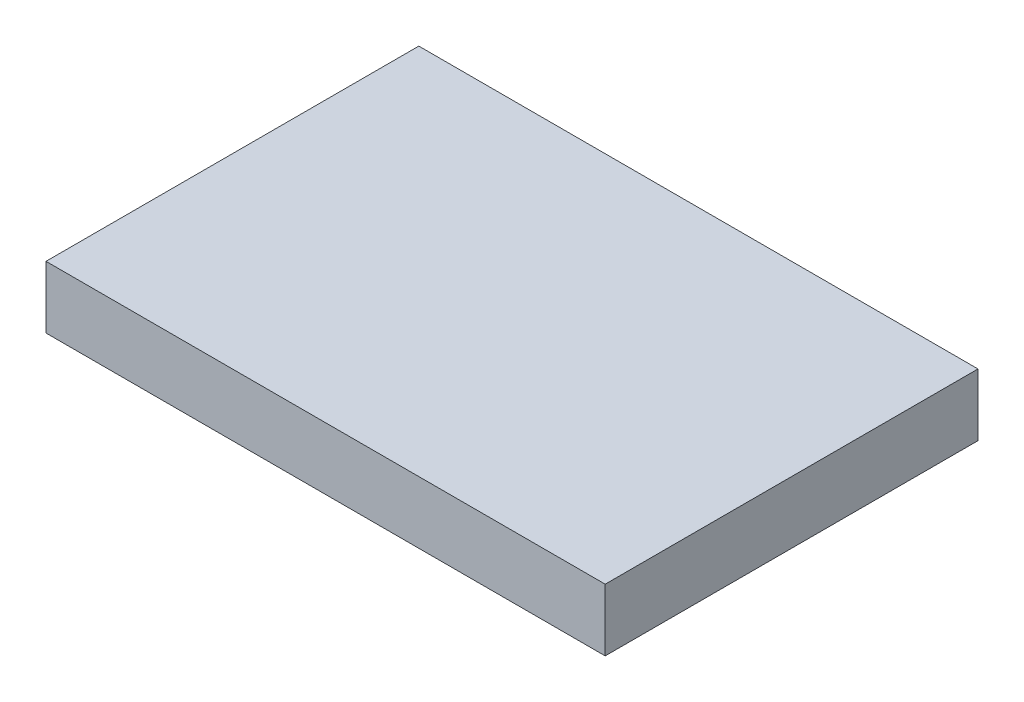
ISO-10303-21;
HEADER;
FILE_DESCRIPTION(('STEP AP214'),'2;1');
FILE_NAME('part.step','',(''),(''),'','','');
FILE_SCHEMA(('AUTOMOTIVE_DESIGN { 1 0 10303 214 1 1 1 1 }'));
ENDSEC;
DATA;
#1=APPLICATION_CONTEXT('core data for automotive mechanical design processes');
#2=APPLICATION_PROTOCOL_DEFINITION('international standard','automotive_design',2000,#1);
#3=PRODUCT_CONTEXT('',#1,'mechanical');
#4=PRODUCT('Part','Part','',(#3));
#5=PRODUCT_RELATED_PRODUCT_CATEGORY('part','',(#4));
#6=PRODUCT_DEFINITION_FORMATION('','',#4);
#7=PRODUCT_DEFINITION_CONTEXT('part definition',#1,'design');
#8=PRODUCT_DEFINITION('design','',#6,#7);
#9=PRODUCT_DEFINITION_SHAPE('','',#8);
#10=(LENGTH_UNIT() NAMED_UNIT(*) SI_UNIT(.MILLI.,.METRE.));
#11=(NAMED_UNIT(*) PLANE_ANGLE_UNIT() SI_UNIT($,.RADIAN.));
#12=(NAMED_UNIT(*) SI_UNIT($,.STERADIAN.) SOLID_ANGLE_UNIT());
#13=UNCERTAINTY_MEASURE_WITH_UNIT(LENGTH_MEASURE(1.E-05),#10,'distance_accuracy_value','');
#14=(GEOMETRIC_REPRESENTATION_CONTEXT(3) GLOBAL_UNCERTAINTY_ASSIGNED_CONTEXT((#13)) GLOBAL_UNIT_ASSIGNED_CONTEXT((#10,
#11,#12)) REPRESENTATION_CONTEXT('',''));
#15=CARTESIAN_POINT('',(0.,0.,0.));
#16=DIRECTION('',(0.,0.,1.));
#17=DIRECTION('',(1.,0.,0.));
#18=AXIS2_PLACEMENT_3D('',#15,#16,#17);
#19=CARTESIAN_POINT('',(0.,0.,0.));
#20=DIRECTION('',(0.,-1.,0.));
#21=DIRECTION('',(1.,0.,0.));
#22=AXIS2_PLACEMENT_3D('',#19,#20,#21);
#23=PLANE('',#22);
#24=DIRECTION('',(0.,0.,-1.));
#25=VECTOR('',#24,1.);
#26=CARTESIAN_POINT('',(-8.99999999999999,0.,6.00000000000001));
#27=LINE('',#26,#25);
#28=CARTESIAN_POINT('',(-8.99999999999999,0.,6.00000000000001));
#29=VERTEX_POINT('',#28);
#30=CARTESIAN_POINT('',(-8.99999999999999,0.,-6.00000000000004));
#31=VERTEX_POINT('',#30);
#32=EDGE_CURVE('E55',#29,#31,#27,.T.);
#33=ORIENTED_EDGE('',*,*,#32,.T.);
#34=DIRECTION('',(1.,0.,0.));
#35=VECTOR('',#34,1.);
#36=CARTESIAN_POINT('',(-8.99999999999999,0.,-6.00000000000004));
#37=LINE('',#36,#35);
#38=CARTESIAN_POINT('',(8.99999999999999,0.,-6.00000000000004));
#39=VERTEX_POINT('',#38);
#40=EDGE_CURVE('E76',#31,#39,#37,.T.);
#41=ORIENTED_EDGE('',*,*,#40,.T.);
#42=DIRECTION('',(0.,0.,1.));
#43=VECTOR('',#42,1.);
#44=CARTESIAN_POINT('',(8.99999999999999,0.,6.00000000000001));
#45=LINE('',#44,#43);
#46=CARTESIAN_POINT('',(8.99999999999999,0.,6.00000000000001));
#47=VERTEX_POINT('',#46);
#48=EDGE_CURVE('E58',#39,#47,#45,.T.);
#49=ORIENTED_EDGE('',*,*,#48,.T.);
#50=DIRECTION('',(-1.,0.,0.));
#51=VECTOR('',#50,1.);
#52=CARTESIAN_POINT('',(-8.99999999999999,0.,6.00000000000001));
#53=LINE('',#52,#51);
#54=EDGE_CURVE('E20',#47,#29,#53,.T.);
#55=ORIENTED_EDGE('',*,*,#54,.T.);
#56=EDGE_LOOP('',(#33,#41,#49,#55));
#57=FACE_BOUND('',#56,.T.);
#58=ADVANCED_FACE('F17',(#57),#23,.T.);
#59=CARTESIAN_POINT('',(-8.99999999999999,2.,6.00000000000001));
#60=DIRECTION('',(0.,0.,-1.));
#61=DIRECTION('',(-1.,0.,0.));
#62=AXIS2_PLACEMENT_3D('',#59,#60,#61);
#63=PLANE('',#62);
#64=DIRECTION('',(0.,1.,0.));
#65=VECTOR('',#64,1.);
#66=CARTESIAN_POINT('',(8.99999999999999,1.99999999999999,6.00000000000001));
#67=LINE('',#66,#65);
#68=CARTESIAN_POINT('',(8.99999999999999,2.,6.00000000000001));
#69=VERTEX_POINT('',#68);
#70=EDGE_CURVE('E78',#47,#69,#67,.T.);
#71=ORIENTED_EDGE('',*,*,#70,.T.);
#72=DIRECTION('',(1.,0.,0.));
#73=VECTOR('',#72,1.);
#74=CARTESIAN_POINT('',(0.,2.,6.00000000000001));
#75=LINE('',#74,#73);
#76=CARTESIAN_POINT('',(-8.99999999999999,2.,6.00000000000001));
#77=VERTEX_POINT('',#76);
#78=EDGE_CURVE('E73',#69,#77,#75,.F.);
#79=ORIENTED_EDGE('',*,*,#78,.T.);
#80=DIRECTION('',(0.,1.,0.));
#81=VECTOR('',#80,1.);
#82=CARTESIAN_POINT('',(-8.99999999999999,2.,6.00000000000001));
#83=LINE('',#82,#81);
#84=EDGE_CURVE('E63',#77,#29,#83,.F.);
#85=ORIENTED_EDGE('',*,*,#84,.T.);
#86=ORIENTED_EDGE('',*,*,#54,.F.);
#87=EDGE_LOOP('',(#71,#79,#85,#86));
#88=FACE_BOUND('',#87,.T.);
#89=ADVANCED_FACE('F72',(#88),#63,.F.);
#90=CARTESIAN_POINT('',(-8.99999999999999,2.,6.00000000000001));
#91=DIRECTION('',(1.,0.,0.));
#92=DIRECTION('',(0.,0.,-1.));
#93=AXIS2_PLACEMENT_3D('',#90,#91,#92);
#94=PLANE('',#93);
#95=ORIENTED_EDGE('',*,*,#84,.F.);
#96=DIRECTION('',(0.,0.,1.));
#97=VECTOR('',#96,1.);
#98=CARTESIAN_POINT('',(-8.99999999999999,2.,0.));
#99=LINE('',#98,#97);
#100=CARTESIAN_POINT('',(-8.99999999999999,2.,-6.00000000000004));
#101=VERTEX_POINT('',#100);
#102=EDGE_CURVE('E83',#77,#101,#99,.F.);
#103=ORIENTED_EDGE('',*,*,#102,.T.);
#104=DIRECTION('',(0.,1.,0.));
#105=VECTOR('',#104,1.);
#106=CARTESIAN_POINT('',(-8.99999999999999,1.99999999999999,-6.00000000000004));
#107=LINE('',#106,#105);
#108=EDGE_CURVE('E69',#101,#31,#107,.F.);
#109=ORIENTED_EDGE('',*,*,#108,.T.);
#110=ORIENTED_EDGE('',*,*,#32,.F.);
#111=EDGE_LOOP('',(#95,#103,#109,#110));
#112=FACE_BOUND('',#111,.T.);
#113=ADVANCED_FACE('F66',(#112),#94,.F.);
#114=CARTESIAN_POINT('',(-8.99999999999999,1.99999999999999,-6.00000000000004));
#115=DIRECTION('',(0.,0.,1.));
#116=DIRECTION('',(1.,0.,0.));
#117=AXIS2_PLACEMENT_3D('',#114,#115,#116);
#118=PLANE('',#117);
#119=ORIENTED_EDGE('',*,*,#108,.F.);
#120=DIRECTION('',(1.,0.,0.));
#121=VECTOR('',#120,1.);
#122=CARTESIAN_POINT('',(0.,2.,-6.00000000000004));
#123=LINE('',#122,#121);
#124=CARTESIAN_POINT('',(8.99999999999999,2.,-6.00000000000004));
#125=VERTEX_POINT('',#124);
#126=EDGE_CURVE('E26',#101,#125,#123,.T.);
#127=ORIENTED_EDGE('',*,*,#126,.T.);
#128=DIRECTION('',(0.,1.,0.));
#129=VECTOR('',#128,1.);
#130=CARTESIAN_POINT('',(8.99999999999999,1.99999999999999,-6.00000000000004));
#131=LINE('',#130,#129);
#132=EDGE_CURVE('E34',#125,#39,#131,.F.);
#133=ORIENTED_EDGE('',*,*,#132,.T.);
#134=ORIENTED_EDGE('',*,*,#40,.F.);
#135=EDGE_LOOP('',(#119,#127,#133,#134));
#136=FACE_BOUND('',#135,.T.);
#137=ADVANCED_FACE('F88',(#136),#118,.F.);
#138=CARTESIAN_POINT('',(8.99999999999999,1.99999999999999,6.00000000000001));
#139=DIRECTION('',(-1.,0.,0.));
#140=DIRECTION('',(0.,0.,1.));
#141=AXIS2_PLACEMENT_3D('',#138,#139,#140);
#142=PLANE('',#141);
#143=ORIENTED_EDGE('',*,*,#132,.F.);
#144=DIRECTION('',(0.,0.,1.));
#145=VECTOR('',#144,1.);
#146=CARTESIAN_POINT('',(8.99999999999999,2.,0.));
#147=LINE('',#146,#145);
#148=EDGE_CURVE('E11',#125,#69,#147,.T.);
#149=ORIENTED_EDGE('',*,*,#148,.T.);
#150=ORIENTED_EDGE('',*,*,#70,.F.);
#151=ORIENTED_EDGE('',*,*,#48,.F.);
#152=EDGE_LOOP('',(#143,#149,#150,#151));
#153=FACE_BOUND('',#152,.T.);
#154=ADVANCED_FACE('F91',(#153),#142,.F.);
#155=CARTESIAN_POINT('',(0.,2.,0.));
#156=DIRECTION('',(0.,-1.,0.));
#157=DIRECTION('',(1.,0.,0.));
#158=AXIS2_PLACEMENT_3D('',#155,#156,#157);
#159=PLANE('',#158);
#160=ORIENTED_EDGE('',*,*,#126,.F.);
#161=ORIENTED_EDGE('',*,*,#102,.F.);
#162=ORIENTED_EDGE('',*,*,#78,.F.);
#163=ORIENTED_EDGE('',*,*,#148,.F.);
#164=EDGE_LOOP('',(#160,#161,#162,#163));
#165=FACE_BOUND('',#164,.T.);
#166=ADVANCED_FACE('F90',(#165),#159,.F.);
#167=CLOSED_SHELL('',(#58,#89,#113,#137,#154,#166));
#168=MANIFOLD_SOLID_BREP('B1',#167);
#169=ADVANCED_BREP_SHAPE_REPRESENTATION('',(#18,#168),#14);
#170=SHAPE_DEFINITION_REPRESENTATION(#9,#169);
ENDSEC;
END-ISO-10303-21;
